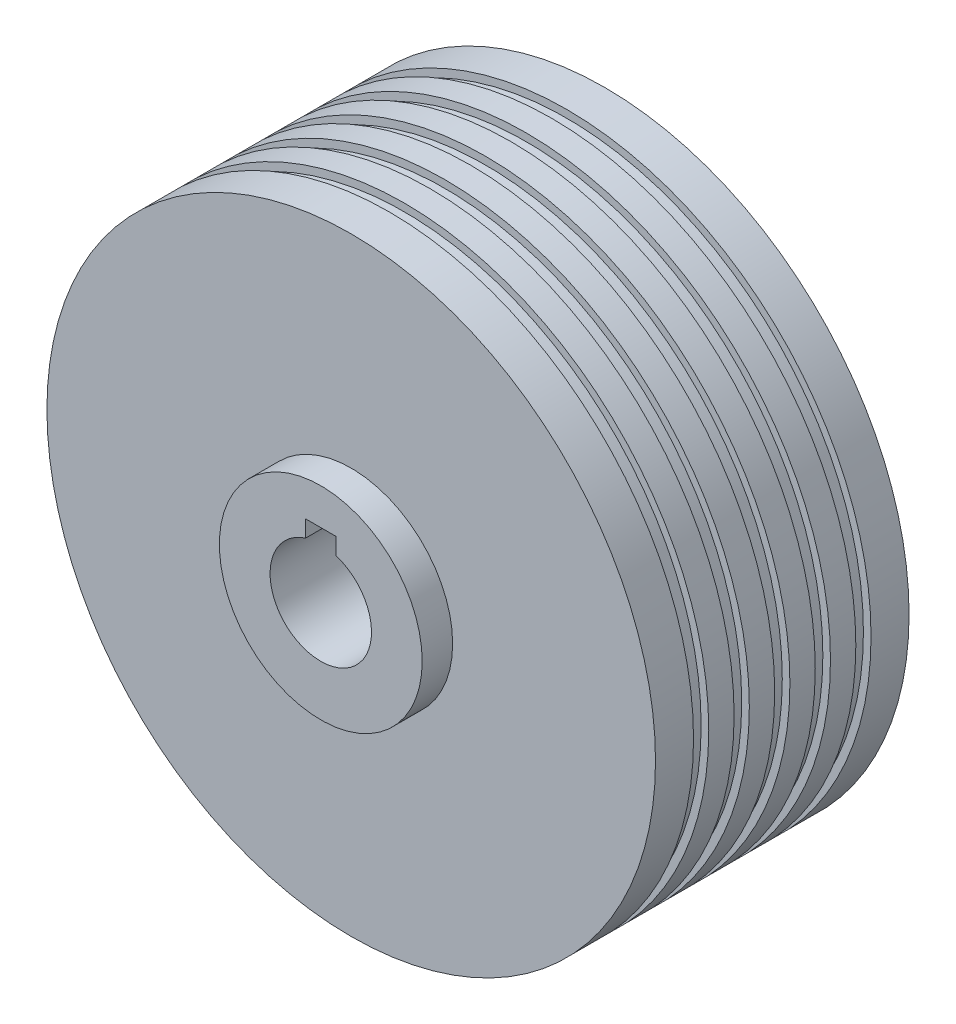
ISO-10303-21;
HEADER;
FILE_DESCRIPTION(('STEP AP214'),'2;1');
FILE_NAME('part.step','',(''),(''),'','','');
FILE_SCHEMA(('AUTOMOTIVE_DESIGN { 1 0 10303 214 1 1 1 1 }'));
ENDSEC;
DATA;
#1=APPLICATION_CONTEXT('core data for automotive mechanical design processes');
#2=APPLICATION_PROTOCOL_DEFINITION('international standard','automotive_design',2000,#1);
#3=PRODUCT_CONTEXT('',#1,'mechanical');
#4=PRODUCT('Part','Part','',(#3));
#5=PRODUCT_RELATED_PRODUCT_CATEGORY('part','',(#4));
#6=PRODUCT_DEFINITION_FORMATION('','',#4);
#7=PRODUCT_DEFINITION_CONTEXT('part definition',#1,'design');
#8=PRODUCT_DEFINITION('design','',#6,#7);
#9=PRODUCT_DEFINITION_SHAPE('','',#8);
#10=(LENGTH_UNIT() NAMED_UNIT(*) SI_UNIT(.MILLI.,.METRE.));
#11=(NAMED_UNIT(*) PLANE_ANGLE_UNIT() SI_UNIT($,.RADIAN.));
#12=(NAMED_UNIT(*) SI_UNIT($,.STERADIAN.) SOLID_ANGLE_UNIT());
#13=UNCERTAINTY_MEASURE_WITH_UNIT(LENGTH_MEASURE(1.E-05),#10,'distance_accuracy_value','');
#14=(GEOMETRIC_REPRESENTATION_CONTEXT(3) GLOBAL_UNCERTAINTY_ASSIGNED_CONTEXT((#13)) GLOBAL_UNIT_ASSIGNED_CONTEXT((#10,
#11,#12)) REPRESENTATION_CONTEXT('',''));
#15=CARTESIAN_POINT('',(0.,0.,0.));
#16=DIRECTION('',(0.,0.,1.));
#17=DIRECTION('',(1.,0.,0.));
#18=AXIS2_PLACEMENT_3D('',#15,#16,#17);
#19=CARTESIAN_POINT('',(0.,0.,25.));
#20=DIRECTION('',(0.,0.,-1.));
#21=DIRECTION('',(-1.,0.,0.));
#22=AXIS2_PLACEMENT_3D('',#19,#20,#21);
#23=CYLINDRICAL_SURFACE('',#22,30.);
#24=CARTESIAN_POINT('',(0.,0.,0.));
#25=DIRECTION('',(0.,0.,1.));
#26=DIRECTION('',(1.,0.,0.));
#27=AXIS2_PLACEMENT_3D('',#24,#25,#26);
#28=CIRCLE('',#27,30.);
#29=CARTESIAN_POINT('',(30.,0.,0.));
#30=VERTEX_POINT('',#29);
#31=EDGE_CURVE('E177',#30,#30,#28,.T.);
#32=ORIENTED_EDGE('',*,*,#31,.T.);
#33=EDGE_LOOP('',(#32));
#34=FACE_BOUND('',#33,.T.);
#35=CARTESIAN_POINT('',(0.,0.,3.75));
#36=DIRECTION('',(0.,0.,1.));
#37=DIRECTION('',(1.,0.,0.));
#38=AXIS2_PLACEMENT_3D('',#35,#36,#37);
#39=CIRCLE('',#38,30.);
#40=CARTESIAN_POINT('',(30.,0.,3.75));
#41=VERTEX_POINT('',#40);
#42=EDGE_CURVE('E200',#41,#41,#39,.T.);
#43=ORIENTED_EDGE('',*,*,#42,.F.);
#44=EDGE_LOOP('',(#43));
#45=FACE_BOUND('',#44,.T.);
#46=ADVANCED_FACE('F47',(#34,#45),#23,.T.);
#47=CARTESIAN_POINT('',(0.,0.,25.));
#48=DIRECTION('',(0.,0.,1.));
#49=DIRECTION('',(1.,0.,0.));
#50=AXIS2_PLACEMENT_3D('',#47,#48,#49);
#51=CIRCLE('',#50,30.);
#52=CARTESIAN_POINT('',(30.,0.,25.));
#53=VERTEX_POINT('',#52);
#54=EDGE_CURVE('E173',#53,#53,#51,.T.);
#55=ORIENTED_EDGE('',*,*,#54,.F.);
#56=EDGE_LOOP('',(#55));
#57=FACE_BOUND('',#56,.T.);
#58=CARTESIAN_POINT('',(0.,0.,21.25));
#59=DIRECTION('',(0.,0.,-1.));
#60=DIRECTION('',(-1.,0.,0.));
#61=AXIS2_PLACEMENT_3D('',#58,#59,#60);
#62=CIRCLE('',#61,30.);
#63=CARTESIAN_POINT('',(-30.,0.,21.25));
#64=VERTEX_POINT('',#63);
#65=EDGE_CURVE('E196',#64,#64,#62,.T.);
#66=ORIENTED_EDGE('',*,*,#65,.F.);
#67=EDGE_LOOP('',(#66));
#68=FACE_BOUND('',#67,.T.);
#69=ADVANCED_FACE('F249',(#57,#68),#23,.T.);
#70=CARTESIAN_POINT('',(0.,0.,25.));
#71=DIRECTION('',(0.,0.,1.));
#72=DIRECTION('',(1.,0.,0.));
#73=AXIS2_PLACEMENT_3D('',#70,#71,#72);
#74=PLANE('',#73);
#75=CARTESIAN_POINT('',(0.,0.,25.));
#76=DIRECTION('',(0.,0.,1.));
#77=DIRECTION('',(1.,0.,0.));
#78=AXIS2_PLACEMENT_3D('',#75,#76,#77);
#79=CIRCLE('',#78,10.);
#80=CARTESIAN_POINT('',(10.,0.,25.));
#81=VERTEX_POINT('',#80);
#82=EDGE_CURVE('E124',#81,#81,#79,.T.);
#83=ORIENTED_EDGE('',*,*,#82,.F.);
#84=EDGE_LOOP('',(#83));
#85=FACE_BOUND('',#84,.T.);
#86=ORIENTED_EDGE('',*,*,#54,.T.);
#87=EDGE_LOOP('',(#86));
#88=FACE_BOUND('',#87,.T.);
#89=ADVANCED_FACE('F245',(#85,#88),#74,.T.);
#90=CARTESIAN_POINT('',(0.,0.,0.));
#91=DIRECTION('',(0.,0.,1.));
#92=DIRECTION('',(1.,0.,0.));
#93=AXIS2_PLACEMENT_3D('',#90,#91,#92);
#94=PLANE('',#93);
#95=DIRECTION('',(1.,0.,0.));
#96=VECTOR('',#95,1.);
#97=CARTESIAN_POINT('',(1.5,6.41969600708473,0.));
#98=LINE('',#97,#96);
#99=CARTESIAN_POINT('',(-1.5,6.41969600708473,0.));
#100=VERTEX_POINT('',#99);
#101=CARTESIAN_POINT('',(1.5,6.41969600708473,0.));
#102=VERTEX_POINT('',#101);
#103=EDGE_CURVE('E89',#100,#102,#98,.T.);
#104=ORIENTED_EDGE('',*,*,#103,.F.);
#105=DIRECTION('',(0.,1.,0.));
#106=VECTOR('',#105,1.);
#107=CARTESIAN_POINT('',(-1.5,6.41969600708473,0.));
#108=LINE('',#107,#106);
#109=CARTESIAN_POINT('',(-1.5,4.76969600708473,0.));
#110=VERTEX_POINT('',#109);
#111=EDGE_CURVE('E97',#110,#100,#108,.T.);
#112=ORIENTED_EDGE('',*,*,#111,.F.);
#113=CARTESIAN_POINT('',(0.,0.,0.));
#114=DIRECTION('',(0.,0.,1.));
#115=DIRECTION('',(1.,0.,0.));
#116=AXIS2_PLACEMENT_3D('',#113,#114,#115);
#117=CIRCLE('',#116,5.);
#118=CARTESIAN_POINT('',(1.5,4.76969600708473,0.));
#119=VERTEX_POINT('',#118);
#120=EDGE_CURVE('E181',#119,#110,#117,.F.);
#121=ORIENTED_EDGE('',*,*,#120,.F.);
#122=DIRECTION('',(0.,-1.,0.));
#123=VECTOR('',#122,1.);
#124=CARTESIAN_POINT('',(1.5,6.41969600708473,0.));
#125=LINE('',#124,#123);
#126=EDGE_CURVE('E94',#102,#119,#125,.T.);
#127=ORIENTED_EDGE('',*,*,#126,.F.);
#128=EDGE_LOOP('',(#104,#112,#121,#127));
#129=FACE_BOUND('',#128,.T.);
#130=ORIENTED_EDGE('',*,*,#31,.F.);
#131=EDGE_LOOP('',(#130));
#132=FACE_BOUND('',#131,.T.);
#133=ADVANCED_FACE('F105',(#129,#132),#94,.F.);
#134=CARTESIAN_POINT('',(0.,0.,26.));
#135=DIRECTION('',(0.,0.,-1.));
#136=DIRECTION('',(-1.,0.,0.));
#137=AXIS2_PLACEMENT_3D('',#134,#135,#136);
#138=CYLINDRICAL_SURFACE('',#137,5.);
#139=DIRECTION('',(0.,0.,-1.));
#140=VECTOR('',#139,1.);
#141=CARTESIAN_POINT('',(-1.5,4.76969600708473,38.));
#142=LINE('',#141,#140);
#143=CARTESIAN_POINT('',(-1.5,4.76969600708473,28.));
#144=VERTEX_POINT('',#143);
#145=EDGE_CURVE('E99',#144,#110,#142,.T.);
#146=ORIENTED_EDGE('',*,*,#145,.F.);
#147=CARTESIAN_POINT('',(0.,0.,28.));
#148=DIRECTION('',(0.,0.,1.));
#149=DIRECTION('',(1.,0.,0.));
#150=AXIS2_PLACEMENT_3D('',#147,#148,#149);
#151=CIRCLE('',#150,5.);
#152=CARTESIAN_POINT('',(1.5,4.76969600708473,28.));
#153=VERTEX_POINT('',#152);
#154=EDGE_CURVE('E114',#144,#153,#151,.T.);
#155=ORIENTED_EDGE('',*,*,#154,.T.);
#156=DIRECTION('',(0.,0.,-1.));
#157=VECTOR('',#156,1.);
#158=CARTESIAN_POINT('',(1.5,4.76969600708473,38.));
#159=LINE('',#158,#157);
#160=EDGE_CURVE('E115',#153,#119,#159,.T.);
#161=ORIENTED_EDGE('',*,*,#160,.T.);
#162=ORIENTED_EDGE('',*,*,#120,.T.);
#163=EDGE_LOOP('',(#146,#155,#161,#162));
#164=FACE_BOUND('',#163,.T.);
#165=ADVANCED_FACE('F233',(#164),#138,.F.);
#166=CARTESIAN_POINT('',(0.,30.7499999999999,21.25));
#167=DIRECTION('',(0.,0.,-1.));
#168=DIRECTION('',(-1.,0.,0.));
#169=AXIS2_PLACEMENT_3D('',#166,#167,#168);
#170=PLANE('',#169);
#171=CARTESIAN_POINT('',(0.,0.,21.25));
#172=DIRECTION('',(0.,0.,1.));
#173=DIRECTION('',(1.,0.,0.));
#174=AXIS2_PLACEMENT_3D('',#171,#172,#173);
#175=CIRCLE('',#174,29.2499999999999);
#176=CARTESIAN_POINT('',(29.2499999999999,0.,21.25));
#177=VERTEX_POINT('',#176);
#178=EDGE_CURVE('E138',#177,#177,#175,.T.);
#179=ORIENTED_EDGE('',*,*,#178,.T.);
#180=EDGE_LOOP('',(#179));
#181=FACE_BOUND('',#180,.T.);
#182=ORIENTED_EDGE('',*,*,#65,.T.);
#183=EDGE_LOOP('',(#182));
#184=FACE_BOUND('',#183,.T.);
#185=ADVANCED_FACE('F235',(#181,#184),#170,.T.);
#186=CARTESIAN_POINT('',(0.,30.7499999999999,19.75));
#187=DIRECTION('',(0.,0.,1.));
#188=DIRECTION('',(1.,0.,0.));
#189=AXIS2_PLACEMENT_3D('',#186,#187,#188);
#190=PLANE('',#189);
#191=CARTESIAN_POINT('',(0.,0.,19.75));
#192=DIRECTION('',(0.,0.,1.));
#193=DIRECTION('',(1.,0.,0.));
#194=AXIS2_PLACEMENT_3D('',#191,#192,#193);
#195=CIRCLE('',#194,29.2499999999999);
#196=CARTESIAN_POINT('',(29.2499999999999,0.,19.75));
#197=VERTEX_POINT('',#196);
#198=EDGE_CURVE('E129',#197,#197,#195,.T.);
#199=ORIENTED_EDGE('',*,*,#198,.F.);
#200=EDGE_LOOP('',(#199));
#201=FACE_BOUND('',#200,.T.);
#202=CARTESIAN_POINT('',(0.,0.,19.75));
#203=DIRECTION('',(0.,0.,1.));
#204=DIRECTION('',(1.,0.,0.));
#205=AXIS2_PLACEMENT_3D('',#202,#203,#204);
#206=CIRCLE('',#205,30.);
#207=CARTESIAN_POINT('',(30.,0.,19.75));
#208=VERTEX_POINT('',#207);
#209=EDGE_CURVE('E192',#208,#208,#206,.T.);
#210=ORIENTED_EDGE('',*,*,#209,.T.);
#211=EDGE_LOOP('',(#210));
#212=FACE_BOUND('',#211,.T.);
#213=ADVANCED_FACE('F242',(#201,#212),#190,.T.);
#214=CARTESIAN_POINT('',(0.,0.,25.));
#215=DIRECTION('',(0.,0.,1.));
#216=DIRECTION('',(1.,0.,0.));
#217=AXIS2_PLACEMENT_3D('',#214,#215,#216);
#218=CYLINDRICAL_SURFACE('',#217,29.2499999999999);
#219=ORIENTED_EDGE('',*,*,#198,.T.);
#220=EDGE_LOOP('',(#219));
#221=FACE_BOUND('',#220,.T.);
#222=ORIENTED_EDGE('',*,*,#178,.F.);
#223=EDGE_LOOP('',(#222));
#224=FACE_BOUND('',#223,.T.);
#225=ADVANCED_FACE('F315',(#221,#224),#218,.T.);
#226=CARTESIAN_POINT('',(0.,30.75,5.25));
#227=DIRECTION('',(0.,0.,-1.));
#228=DIRECTION('',(-1.,0.,0.));
#229=AXIS2_PLACEMENT_3D('',#226,#227,#228);
#230=PLANE('',#229);
#231=CARTESIAN_POINT('',(0.,0.,5.25));
#232=DIRECTION('',(0.,0.,1.));
#233=DIRECTION('',(1.,0.,0.));
#234=AXIS2_PLACEMENT_3D('',#231,#232,#233);
#235=CIRCLE('',#234,29.25);
#236=CARTESIAN_POINT('',(29.25,0.,5.25));
#237=VERTEX_POINT('',#236);
#238=EDGE_CURVE('E137',#237,#237,#235,.T.);
#239=ORIENTED_EDGE('',*,*,#238,.T.);
#240=EDGE_LOOP('',(#239));
#241=FACE_BOUND('',#240,.T.);
#242=CARTESIAN_POINT('',(0.,0.,5.25));
#243=DIRECTION('',(0.,0.,-1.));
#244=DIRECTION('',(-1.,0.,0.));
#245=AXIS2_PLACEMENT_3D('',#242,#243,#244);
#246=CIRCLE('',#245,30.);
#247=CARTESIAN_POINT('',(-30.,0.,5.25));
#248=VERTEX_POINT('',#247);
#249=EDGE_CURVE('E204',#248,#248,#246,.T.);
#250=ORIENTED_EDGE('',*,*,#249,.T.);
#251=EDGE_LOOP('',(#250));
#252=FACE_BOUND('',#251,.T.);
#253=ADVANCED_FACE('F420',(#241,#252),#230,.T.);
#254=CARTESIAN_POINT('',(0.,30.75,3.75));
#255=DIRECTION('',(0.,0.,1.));
#256=DIRECTION('',(1.,0.,0.));
#257=AXIS2_PLACEMENT_3D('',#254,#255,#256);
#258=PLANE('',#257);
#259=CARTESIAN_POINT('',(0.,0.,3.75));
#260=DIRECTION('',(0.,0.,1.));
#261=DIRECTION('',(1.,0.,0.));
#262=AXIS2_PLACEMENT_3D('',#259,#260,#261);
#263=CIRCLE('',#262,29.25);
#264=CARTESIAN_POINT('',(29.25,0.,3.75));
#265=VERTEX_POINT('',#264);
#266=EDGE_CURVE('E133',#265,#265,#263,.T.);
#267=ORIENTED_EDGE('',*,*,#266,.F.);
#268=EDGE_LOOP('',(#267));
#269=FACE_BOUND('',#268,.T.);
#270=ORIENTED_EDGE('',*,*,#42,.T.);
#271=EDGE_LOOP('',(#270));
#272=FACE_BOUND('',#271,.T.);
#273=ADVANCED_FACE('F269',(#269,#272),#258,.T.);
#274=CARTESIAN_POINT('',(0.,0.,25.));
#275=DIRECTION('',(0.,0.,1.));
#276=DIRECTION('',(1.,0.,0.));
#277=AXIS2_PLACEMENT_3D('',#274,#275,#276);
#278=CYLINDRICAL_SURFACE('',#277,29.25);
#279=ORIENTED_EDGE('',*,*,#266,.T.);
#280=EDGE_LOOP('',(#279));
#281=FACE_BOUND('',#280,.T.);
#282=ORIENTED_EDGE('',*,*,#238,.F.);
#283=EDGE_LOOP('',(#282));
#284=FACE_BOUND('',#283,.T.);
#285=ADVANCED_FACE('F259',(#281,#284),#278,.T.);
#286=ORIENTED_EDGE('',*,*,#249,.F.);
#287=EDGE_LOOP('',(#286));
#288=FACE_BOUND('',#287,.T.);
#289=CARTESIAN_POINT('',(0.,0.,7.75));
#290=DIRECTION('',(0.,0.,1.));
#291=DIRECTION('',(1.,0.,0.));
#292=AXIS2_PLACEMENT_3D('',#289,#290,#291);
#293=CIRCLE('',#292,30.);
#294=CARTESIAN_POINT('',(30.,0.,7.75));
#295=VERTEX_POINT('',#294);
#296=EDGE_CURVE('E208',#295,#295,#293,.T.);
#297=ORIENTED_EDGE('',*,*,#296,.F.);
#298=EDGE_LOOP('',(#297));
#299=FACE_BOUND('',#298,.T.);
#300=ADVANCED_FACE('F251',(#288,#299),#23,.T.);
#301=CARTESIAN_POINT('',(0.,30.75,9.25));
#302=DIRECTION('',(0.,0.,-1.));
#303=DIRECTION('',(-1.,0.,0.));
#304=AXIS2_PLACEMENT_3D('',#301,#302,#303);
#305=PLANE('',#304);
#306=CARTESIAN_POINT('',(0.,0.,9.25));
#307=DIRECTION('',(0.,0.,1.));
#308=DIRECTION('',(1.,0.,0.));
#309=AXIS2_PLACEMENT_3D('',#306,#307,#308);
#310=CIRCLE('',#309,29.25);
#311=CARTESIAN_POINT('',(29.25,0.,9.25));
#312=VERTEX_POINT('',#311);
#313=EDGE_CURVE('E154',#312,#312,#310,.T.);
#314=ORIENTED_EDGE('',*,*,#313,.T.);
#315=EDGE_LOOP('',(#314));
#316=FACE_BOUND('',#315,.T.);
#317=CARTESIAN_POINT('',(0.,0.,9.25));
#318=DIRECTION('',(0.,0.,-1.));
#319=DIRECTION('',(-1.,0.,0.));
#320=AXIS2_PLACEMENT_3D('',#317,#318,#319);
#321=CIRCLE('',#320,30.);
#322=CARTESIAN_POINT('',(-30.,0.,9.25));
#323=VERTEX_POINT('',#322);
#324=EDGE_CURVE('E212',#323,#323,#321,.T.);
#325=ORIENTED_EDGE('',*,*,#324,.T.);
#326=EDGE_LOOP('',(#325));
#327=FACE_BOUND('',#326,.T.);
#328=ADVANCED_FACE('F258',(#316,#327),#305,.T.);
#329=CARTESIAN_POINT('',(0.,30.75,7.75));
#330=DIRECTION('',(0.,0.,1.));
#331=DIRECTION('',(1.,0.,0.));
#332=AXIS2_PLACEMENT_3D('',#329,#330,#331);
#333=PLANE('',#332);
#334=CARTESIAN_POINT('',(0.,0.,7.75));
#335=DIRECTION('',(0.,0.,1.));
#336=DIRECTION('',(1.,0.,0.));
#337=AXIS2_PLACEMENT_3D('',#334,#335,#336);
#338=CIRCLE('',#337,29.25);
#339=CARTESIAN_POINT('',(29.25,0.,7.75));
#340=VERTEX_POINT('',#339);
#341=EDGE_CURVE('E142',#340,#340,#338,.T.);
#342=ORIENTED_EDGE('',*,*,#341,.F.);
#343=EDGE_LOOP('',(#342));
#344=FACE_BOUND('',#343,.T.);
#345=ORIENTED_EDGE('',*,*,#296,.T.);
#346=EDGE_LOOP('',(#345));
#347=FACE_BOUND('',#346,.T.);
#348=ADVANCED_FACE('F266',(#344,#347),#333,.T.);
#349=CARTESIAN_POINT('',(0.,0.,25.));
#350=DIRECTION('',(0.,0.,1.));
#351=DIRECTION('',(1.,0.,0.));
#352=AXIS2_PLACEMENT_3D('',#349,#350,#351);
#353=CYLINDRICAL_SURFACE('',#352,29.25);
#354=ORIENTED_EDGE('',*,*,#341,.T.);
#355=EDGE_LOOP('',(#354));
#356=FACE_BOUND('',#355,.T.);
#357=ORIENTED_EDGE('',*,*,#313,.F.);
#358=EDGE_LOOP('',(#357));
#359=FACE_BOUND('',#358,.T.);
#360=ADVANCED_FACE('F275',(#356,#359),#353,.T.);
#361=CARTESIAN_POINT('',(0.,0.,11.75));
#362=DIRECTION('',(0.,0.,1.));
#363=DIRECTION('',(1.,0.,0.));
#364=AXIS2_PLACEMENT_3D('',#361,#362,#363);
#365=CIRCLE('',#364,30.);
#366=CARTESIAN_POINT('',(30.,0.,11.75));
#367=VERTEX_POINT('',#366);
#368=EDGE_CURVE('E188',#367,#367,#365,.T.);
#369=ORIENTED_EDGE('',*,*,#368,.F.);
#370=EDGE_LOOP('',(#369));
#371=FACE_BOUND('',#370,.T.);
#372=ORIENTED_EDGE('',*,*,#324,.F.);
#373=EDGE_LOOP('',(#372));
#374=FACE_BOUND('',#373,.T.);
#375=ADVANCED_FACE('F261',(#371,#374),#23,.T.);
#376=ORIENTED_EDGE('',*,*,#209,.F.);
#377=EDGE_LOOP('',(#376));
#378=FACE_BOUND('',#377,.T.);
#379=CARTESIAN_POINT('',(0.,0.,17.25));
#380=DIRECTION('',(0.,0.,-1.));
#381=DIRECTION('',(-1.,0.,0.));
#382=AXIS2_PLACEMENT_3D('',#379,#380,#381);
#383=CIRCLE('',#382,30.);
#384=CARTESIAN_POINT('',(-30.,0.,17.25));
#385=VERTEX_POINT('',#384);
#386=EDGE_CURVE('E184',#385,#385,#383,.T.);
#387=ORIENTED_EDGE('',*,*,#386,.F.);
#388=EDGE_LOOP('',(#387));
#389=FACE_BOUND('',#388,.T.);
#390=ADVANCED_FACE('F49',(#378,#389),#23,.T.);
#391=CARTESIAN_POINT('',(0.,30.75,17.25));
#392=DIRECTION('',(0.,0.,-1.));
#393=DIRECTION('',(-1.,0.,0.));
#394=AXIS2_PLACEMENT_3D('',#391,#392,#393);
#395=PLANE('',#394);
#396=CARTESIAN_POINT('',(0.,0.,17.25));
#397=DIRECTION('',(0.,0.,1.));
#398=DIRECTION('',(1.,0.,0.));
#399=AXIS2_PLACEMENT_3D('',#396,#397,#398);
#400=CIRCLE('',#399,29.25);
#401=CARTESIAN_POINT('',(29.25,0.,17.25));
#402=VERTEX_POINT('',#401);
#403=EDGE_CURVE('E153',#402,#402,#400,.T.);
#404=ORIENTED_EDGE('',*,*,#403,.T.);
#405=EDGE_LOOP('',(#404));
#406=FACE_BOUND('',#405,.T.);
#407=ORIENTED_EDGE('',*,*,#386,.T.);
#408=EDGE_LOOP('',(#407));
#409=FACE_BOUND('',#408,.T.);
#410=ADVANCED_FACE('F282',(#406,#409),#395,.T.);
#411=CARTESIAN_POINT('',(0.,30.75,15.75));
#412=DIRECTION('',(0.,0.,1.));
#413=DIRECTION('',(1.,0.,0.));
#414=AXIS2_PLACEMENT_3D('',#411,#412,#413);
#415=PLANE('',#414);
#416=CARTESIAN_POINT('',(0.,0.,15.75));
#417=DIRECTION('',(0.,0.,1.));
#418=DIRECTION('',(1.,0.,0.));
#419=AXIS2_PLACEMENT_3D('',#416,#417,#418);
#420=CIRCLE('',#419,29.25);
#421=CARTESIAN_POINT('',(29.25,0.,15.75));
#422=VERTEX_POINT('',#421);
#423=EDGE_CURVE('E149',#422,#422,#420,.T.);
#424=ORIENTED_EDGE('',*,*,#423,.F.);
#425=EDGE_LOOP('',(#424));
#426=FACE_BOUND('',#425,.T.);
#427=CARTESIAN_POINT('',(0.,0.,15.75));
#428=DIRECTION('',(0.,0.,1.));
#429=DIRECTION('',(1.,0.,0.));
#430=AXIS2_PLACEMENT_3D('',#427,#428,#429);
#431=CIRCLE('',#430,30.);
#432=CARTESIAN_POINT('',(30.,0.,15.75));
#433=VERTEX_POINT('',#432);
#434=EDGE_CURVE('E216',#433,#433,#431,.T.);
#435=ORIENTED_EDGE('',*,*,#434,.T.);
#436=EDGE_LOOP('',(#435));
#437=FACE_BOUND('',#436,.T.);
#438=ADVANCED_FACE('F298',(#426,#437),#415,.T.);
#439=CARTESIAN_POINT('',(0.,0.,25.));
#440=DIRECTION('',(0.,0.,1.));
#441=DIRECTION('',(1.,0.,0.));
#442=AXIS2_PLACEMENT_3D('',#439,#440,#441);
#443=CYLINDRICAL_SURFACE('',#442,29.25);
#444=ORIENTED_EDGE('',*,*,#423,.T.);
#445=EDGE_LOOP('',(#444));
#446=FACE_BOUND('',#445,.T.);
#447=ORIENTED_EDGE('',*,*,#403,.F.);
#448=EDGE_LOOP('',(#447));
#449=FACE_BOUND('',#448,.T.);
#450=ADVANCED_FACE('F290',(#446,#449),#443,.T.);
#451=CARTESIAN_POINT('',(0.,0.,13.25));
#452=DIRECTION('',(0.,0.,-1.));
#453=DIRECTION('',(-1.,0.,0.));
#454=AXIS2_PLACEMENT_3D('',#451,#452,#453);
#455=CIRCLE('',#454,30.);
#456=CARTESIAN_POINT('',(-30.,0.,13.25));
#457=VERTEX_POINT('',#456);
#458=EDGE_CURVE('E172',#457,#457,#455,.T.);
#459=ORIENTED_EDGE('',*,*,#458,.F.);
#460=EDGE_LOOP('',(#459));
#461=FACE_BOUND('',#460,.T.);
#462=ORIENTED_EDGE('',*,*,#434,.F.);
#463=EDGE_LOOP('',(#462));
#464=FACE_BOUND('',#463,.T.);
#465=ADVANCED_FACE('F277',(#461,#464),#23,.T.);
#466=CARTESIAN_POINT('',(0.,30.75,11.75));
#467=DIRECTION('',(0.,0.,1.));
#468=DIRECTION('',(1.,0.,0.));
#469=AXIS2_PLACEMENT_3D('',#466,#467,#468);
#470=PLANE('',#469);
#471=CARTESIAN_POINT('',(0.,0.,11.75));
#472=DIRECTION('',(0.,0.,1.));
#473=DIRECTION('',(1.,0.,0.));
#474=AXIS2_PLACEMENT_3D('',#471,#472,#473);
#475=CIRCLE('',#474,29.25);
#476=CARTESIAN_POINT('',(29.25,0.,11.75));
#477=VERTEX_POINT('',#476);
#478=EDGE_CURVE('E158',#477,#477,#475,.T.);
#479=ORIENTED_EDGE('',*,*,#478,.F.);
#480=EDGE_LOOP('',(#479));
#481=FACE_BOUND('',#480,.T.);
#482=ORIENTED_EDGE('',*,*,#368,.T.);
#483=EDGE_LOOP('',(#482));
#484=FACE_BOUND('',#483,.T.);
#485=ADVANCED_FACE('F289',(#481,#484),#470,.T.);
#486=CARTESIAN_POINT('',(0.,30.75,13.25));
#487=DIRECTION('',(0.,0.,-1.));
#488=DIRECTION('',(-1.,0.,0.));
#489=AXIS2_PLACEMENT_3D('',#486,#487,#488);
#490=PLANE('',#489);
#491=CARTESIAN_POINT('',(0.,0.,13.25));
#492=DIRECTION('',(0.,0.,1.));
#493=DIRECTION('',(1.,0.,0.));
#494=AXIS2_PLACEMENT_3D('',#491,#492,#493);
#495=CIRCLE('',#494,29.25);
#496=CARTESIAN_POINT('',(29.25,0.,13.25));
#497=VERTEX_POINT('',#496);
#498=EDGE_CURVE('E168',#497,#497,#495,.T.);
#499=ORIENTED_EDGE('',*,*,#498,.T.);
#500=EDGE_LOOP('',(#499));
#501=FACE_BOUND('',#500,.T.);
#502=ORIENTED_EDGE('',*,*,#458,.T.);
#503=EDGE_LOOP('',(#502));
#504=FACE_BOUND('',#503,.T.);
#505=ADVANCED_FACE('F296',(#501,#504),#490,.T.);
#506=CARTESIAN_POINT('',(0.,0.,25.));
#507=DIRECTION('',(0.,0.,1.));
#508=DIRECTION('',(1.,0.,0.));
#509=AXIS2_PLACEMENT_3D('',#506,#507,#508);
#510=CYLINDRICAL_SURFACE('',#509,29.25);
#511=ORIENTED_EDGE('',*,*,#478,.T.);
#512=EDGE_LOOP('',(#511));
#513=FACE_BOUND('',#512,.T.);
#514=ORIENTED_EDGE('',*,*,#498,.F.);
#515=EDGE_LOOP('',(#514));
#516=FACE_BOUND('',#515,.T.);
#517=ADVANCED_FACE('F320',(#513,#516),#510,.T.);
#518=CARTESIAN_POINT('',(0.,0.,28.));
#519=DIRECTION('',(0.,0.,-1.));
#520=DIRECTION('',(-1.,0.,0.));
#521=AXIS2_PLACEMENT_3D('',#518,#519,#520);
#522=CYLINDRICAL_SURFACE('',#521,10.);
#523=CARTESIAN_POINT('',(0.,0.,28.));
#524=DIRECTION('',(0.,0.,1.));
#525=DIRECTION('',(1.,0.,0.));
#526=AXIS2_PLACEMENT_3D('',#523,#524,#525);
#527=CIRCLE('',#526,10.);
#528=CARTESIAN_POINT('',(10.,0.,28.));
#529=VERTEX_POINT('',#528);
#530=EDGE_CURVE('E125',#529,#529,#527,.T.);
#531=ORIENTED_EDGE('',*,*,#530,.F.);
#532=EDGE_LOOP('',(#531));
#533=FACE_BOUND('',#532,.T.);
#534=ORIENTED_EDGE('',*,*,#82,.T.);
#535=EDGE_LOOP('',(#534));
#536=FACE_BOUND('',#535,.T.);
#537=ADVANCED_FACE('F323',(#533,#536),#522,.T.);
#538=CARTESIAN_POINT('',(0.,0.,28.));
#539=DIRECTION('',(0.,0.,1.));
#540=DIRECTION('',(1.,0.,0.));
#541=AXIS2_PLACEMENT_3D('',#538,#539,#540);
#542=PLANE('',#541);
#543=DIRECTION('',(0.,-1.,0.));
#544=VECTOR('',#543,1.);
#545=CARTESIAN_POINT('',(-1.5,0.,28.));
#546=LINE('',#545,#544);
#547=CARTESIAN_POINT('',(-1.5,6.41969600708473,28.));
#548=VERTEX_POINT('',#547);
#549=EDGE_CURVE('E11',#548,#144,#546,.T.);
#550=ORIENTED_EDGE('',*,*,#549,.F.);
#551=DIRECTION('',(-1.,0.,0.));
#552=VECTOR('',#551,1.);
#553=CARTESIAN_POINT('',(0.,6.41969600708473,28.));
#554=LINE('',#553,#552);
#555=CARTESIAN_POINT('',(1.5,6.41969600708473,28.));
#556=VERTEX_POINT('',#555);
#557=EDGE_CURVE('E92',#556,#548,#554,.T.);
#558=ORIENTED_EDGE('',*,*,#557,.F.);
#559=DIRECTION('',(0.,1.,0.));
#560=VECTOR('',#559,1.);
#561=CARTESIAN_POINT('',(1.5,0.,28.));
#562=LINE('',#561,#560);
#563=EDGE_CURVE('E56',#153,#556,#562,.T.);
#564=ORIENTED_EDGE('',*,*,#563,.F.);
#565=ORIENTED_EDGE('',*,*,#154,.F.);
#566=EDGE_LOOP('',(#550,#558,#564,#565));
#567=FACE_BOUND('',#566,.T.);
#568=ORIENTED_EDGE('',*,*,#530,.T.);
#569=EDGE_LOOP('',(#568));
#570=FACE_BOUND('',#569,.T.);
#571=ADVANCED_FACE('F230',(#567,#570),#542,.T.);
#572=CARTESIAN_POINT('',(-1.5,6.41969600708473,38.));
#573=DIRECTION('',(-1.,0.,0.));
#574=DIRECTION('',(0.,0.,1.));
#575=AXIS2_PLACEMENT_3D('',#572,#573,#574);
#576=PLANE('',#575);
#577=ORIENTED_EDGE('',*,*,#549,.T.);
#578=ORIENTED_EDGE('',*,*,#145,.T.);
#579=ORIENTED_EDGE('',*,*,#111,.T.);
#580=DIRECTION('',(0.,0.,-1.));
#581=VECTOR('',#580,1.);
#582=CARTESIAN_POINT('',(-1.5,6.41969600708473,38.));
#583=LINE('',#582,#581);
#584=EDGE_CURVE('E85',#548,#100,#583,.T.);
#585=ORIENTED_EDGE('',*,*,#584,.F.);
#586=EDGE_LOOP('',(#577,#578,#579,#585));
#587=FACE_BOUND('',#586,.T.);
#588=ADVANCED_FACE('F98',(#587),#576,.F.);
#589=CARTESIAN_POINT('',(1.5,6.41969600708473,38.));
#590=DIRECTION('',(1.,0.,0.));
#591=DIRECTION('',(0.,1.,0.));
#592=AXIS2_PLACEMENT_3D('',#589,#590,#591);
#593=PLANE('',#592);
#594=ORIENTED_EDGE('',*,*,#563,.T.);
#595=DIRECTION('',(0.,0.,-1.));
#596=VECTOR('',#595,1.);
#597=CARTESIAN_POINT('',(1.5,6.41969600708473,38.));
#598=LINE('',#597,#596);
#599=EDGE_CURVE('E63',#556,#102,#598,.T.);
#600=ORIENTED_EDGE('',*,*,#599,.T.);
#601=ORIENTED_EDGE('',*,*,#126,.T.);
#602=ORIENTED_EDGE('',*,*,#160,.F.);
#603=EDGE_LOOP('',(#594,#600,#601,#602));
#604=FACE_BOUND('',#603,.T.);
#605=ADVANCED_FACE('F227',(#604),#593,.F.);
#606=CARTESIAN_POINT('',(1.5,6.41969600708473,38.));
#607=DIRECTION('',(0.,1.,0.));
#608=DIRECTION('',(0.,0.,1.));
#609=AXIS2_PLACEMENT_3D('',#606,#607,#608);
#610=PLANE('',#609);
#611=ORIENTED_EDGE('',*,*,#557,.T.);
#612=ORIENTED_EDGE('',*,*,#584,.T.);
#613=ORIENTED_EDGE('',*,*,#103,.T.);
#614=ORIENTED_EDGE('',*,*,#599,.F.);
#615=EDGE_LOOP('',(#611,#612,#613,#614));
#616=FACE_BOUND('',#615,.T.);
#617=ADVANCED_FACE('F87',(#616),#610,.F.);
#618=CLOSED_SHELL('',(#46,#69,#89,#133,#165,#185,#213,#225,#253,#273,#285,#300,#328,#348,#360,
#375,#390,#410,#438,#450,#465,#485,#505,#517,#537,#571,#588,#605,#617));
#619=MANIFOLD_SOLID_BREP('B2',#618);
#620=ADVANCED_BREP_SHAPE_REPRESENTATION('',(#18,#619),#14);
#621=SHAPE_DEFINITION_REPRESENTATION(#9,#620);
ENDSEC;
END-ISO-10303-21;
